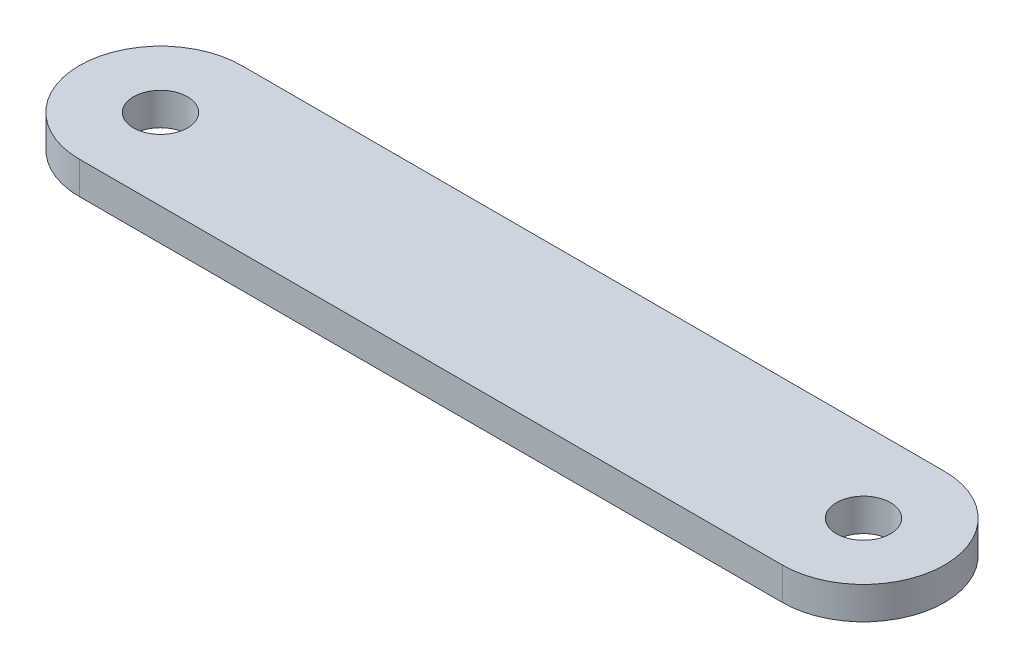
ISO-10303-21;
HEADER;
FILE_DESCRIPTION(('STEP AP214'),'2;1');
FILE_NAME('part.step','',(''),(''),'','','');
FILE_SCHEMA(('AUTOMOTIVE_DESIGN { 1 0 10303 214 1 1 1 1 }'));
ENDSEC;
DATA;
#1=APPLICATION_CONTEXT('core data for automotive mechanical design processes');
#2=APPLICATION_PROTOCOL_DEFINITION('international standard','automotive_design',2000,#1);
#3=PRODUCT_CONTEXT('',#1,'mechanical');
#4=PRODUCT('Part','Part','',(#3));
#5=PRODUCT_RELATED_PRODUCT_CATEGORY('part','',(#4));
#6=PRODUCT_DEFINITION_FORMATION('','',#4);
#7=PRODUCT_DEFINITION_CONTEXT('part definition',#1,'design');
#8=PRODUCT_DEFINITION('design','',#6,#7);
#9=PRODUCT_DEFINITION_SHAPE('','',#8);
#10=(LENGTH_UNIT() NAMED_UNIT(*) SI_UNIT(.MILLI.,.METRE.));
#11=(NAMED_UNIT(*) PLANE_ANGLE_UNIT() SI_UNIT($,.RADIAN.));
#12=(NAMED_UNIT(*) SI_UNIT($,.STERADIAN.) SOLID_ANGLE_UNIT());
#13=UNCERTAINTY_MEASURE_WITH_UNIT(LENGTH_MEASURE(1.E-05),#10,'distance_accuracy_value','');
#14=(GEOMETRIC_REPRESENTATION_CONTEXT(3) GLOBAL_UNCERTAINTY_ASSIGNED_CONTEXT((#13)) GLOBAL_UNIT_ASSIGNED_CONTEXT((#10,
#11,#12)) REPRESENTATION_CONTEXT('',''));
#15=CARTESIAN_POINT('',(0.,0.,0.));
#16=DIRECTION('',(0.,0.,1.));
#17=DIRECTION('',(1.,0.,0.));
#18=AXIS2_PLACEMENT_3D('',#15,#16,#17);
#19=CARTESIAN_POINT('',(123.5,6.,-13.5000000000001));
#20=DIRECTION('',(0.,1.,0.));
#21=DIRECTION('',(0.,0.,1.));
#22=AXIS2_PLACEMENT_3D('',#19,#20,#21);
#23=PLANE('',#22);
#24=CARTESIAN_POINT('',(-6.50000000000001,6.,-13.5));
#25=DIRECTION('',(0.,1.,0.));
#26=DIRECTION('',(0.,0.,1.));
#27=AXIS2_PLACEMENT_3D('',#24,#25,#26);
#28=CIRCLE('',#27,5.);
#29=CARTESIAN_POINT('',(-6.50000000000001,6.,-8.5));
#30=VERTEX_POINT('',#29);
#31=EDGE_CURVE('E104',#30,#30,#28,.T.);
#32=ORIENTED_EDGE('',*,*,#31,.F.);
#33=EDGE_LOOP('',(#32));
#34=FACE_BOUND('',#33,.T.);
#35=CARTESIAN_POINT('',(123.5,6.,-13.5000000000001));
#36=DIRECTION('',(0.,1.,0.));
#37=DIRECTION('',(0.,0.,1.));
#38=AXIS2_PLACEMENT_3D('',#35,#36,#37);
#39=CIRCLE('',#38,15.);
#40=CARTESIAN_POINT('',(123.5,6.,1.49999999999992));
#41=VERTEX_POINT('',#40);
#42=CARTESIAN_POINT('',(123.5,6.,-28.5000000000001));
#43=VERTEX_POINT('',#42);
#44=EDGE_CURVE('E89',#41,#43,#39,.T.);
#45=ORIENTED_EDGE('',*,*,#44,.T.);
#46=DIRECTION('',(-1.,0.,0.));
#47=VECTOR('',#46,1.);
#48=CARTESIAN_POINT('',(-6.50000000000001,6.,-28.5));
#49=LINE('',#48,#47);
#50=CARTESIAN_POINT('',(-6.50000000000001,6.,-28.5));
#51=VERTEX_POINT('',#50);
#52=EDGE_CURVE('E84',#43,#51,#49,.T.);
#53=ORIENTED_EDGE('',*,*,#52,.T.);
#54=CARTESIAN_POINT('',(-6.50000000000001,6.,-13.5));
#55=DIRECTION('',(0.,1.,0.));
#56=DIRECTION('',(0.,0.,1.));
#57=AXIS2_PLACEMENT_3D('',#54,#55,#56);
#58=CIRCLE('',#57,15.);
#59=CARTESIAN_POINT('',(-6.5,6.,1.5));
#60=VERTEX_POINT('',#59);
#61=EDGE_CURVE('E87',#51,#60,#58,.T.);
#62=ORIENTED_EDGE('',*,*,#61,.T.);
#63=DIRECTION('',(1.,0.,0.));
#64=VECTOR('',#63,1.);
#65=CARTESIAN_POINT('',(-6.5,6.,1.5));
#66=LINE('',#65,#64);
#67=EDGE_CURVE('E54',#60,#41,#66,.T.);
#68=ORIENTED_EDGE('',*,*,#67,.T.);
#69=EDGE_LOOP('',(#45,#53,#62,#68));
#70=FACE_BOUND('',#69,.T.);
#71=CARTESIAN_POINT('',(123.5,6.,-13.5000000000001));
#72=DIRECTION('',(0.,1.,0.));
#73=DIRECTION('',(0.,0.,1.));
#74=AXIS2_PLACEMENT_3D('',#71,#72,#73);
#75=CIRCLE('',#74,5.);
#76=CARTESIAN_POINT('',(123.5,6.,-8.50000000000008));
#77=VERTEX_POINT('',#76);
#78=EDGE_CURVE('E119',#77,#77,#75,.T.);
#79=ORIENTED_EDGE('',*,*,#78,.F.);
#80=EDGE_LOOP('',(#79));
#81=FACE_BOUND('',#80,.T.);
#82=ADVANCED_FACE('F37',(#34,#70,#81),#23,.T.);
#83=CARTESIAN_POINT('',(123.5,0.,-13.5000000000001));
#84=DIRECTION('',(0.,1.,0.));
#85=DIRECTION('',(0.,0.,1.));
#86=AXIS2_PLACEMENT_3D('',#83,#84,#85);
#87=PLANE('',#86);
#88=CARTESIAN_POINT('',(123.5,0.,-13.5000000000001));
#89=DIRECTION('',(0.,1.,0.));
#90=DIRECTION('',(0.,0.,1.));
#91=AXIS2_PLACEMENT_3D('',#88,#89,#90);
#92=CIRCLE('',#91,15.);
#93=CARTESIAN_POINT('',(123.5,0.,1.49999999999992));
#94=VERTEX_POINT('',#93);
#95=CARTESIAN_POINT('',(123.5,0.,-28.5000000000001));
#96=VERTEX_POINT('',#95);
#97=EDGE_CURVE('E101',#94,#96,#92,.T.);
#98=ORIENTED_EDGE('',*,*,#97,.F.);
#99=DIRECTION('',(1.,0.,0.));
#100=VECTOR('',#99,1.);
#101=CARTESIAN_POINT('',(-6.5,0.,1.5));
#102=LINE('',#101,#100);
#103=CARTESIAN_POINT('',(-6.5,0.,1.5));
#104=VERTEX_POINT('',#103);
#105=EDGE_CURVE('E77',#104,#94,#102,.T.);
#106=ORIENTED_EDGE('',*,*,#105,.F.);
#107=CARTESIAN_POINT('',(-6.50000000000001,0.,-13.5));
#108=DIRECTION('',(0.,1.,0.));
#109=DIRECTION('',(0.,0.,1.));
#110=AXIS2_PLACEMENT_3D('',#107,#108,#109);
#111=CIRCLE('',#110,15.);
#112=CARTESIAN_POINT('',(-6.50000000000001,0.,-28.5));
#113=VERTEX_POINT('',#112);
#114=EDGE_CURVE('E71',#113,#104,#111,.T.);
#115=ORIENTED_EDGE('',*,*,#114,.F.);
#116=DIRECTION('',(-1.,0.,0.));
#117=VECTOR('',#116,1.);
#118=CARTESIAN_POINT('',(-6.50000000000001,0.,-28.5));
#119=LINE('',#118,#117);
#120=EDGE_CURVE('E93',#96,#113,#119,.T.);
#121=ORIENTED_EDGE('',*,*,#120,.F.);
#122=EDGE_LOOP('',(#98,#106,#115,#121));
#123=FACE_BOUND('',#122,.T.);
#124=CARTESIAN_POINT('',(-6.50000000000001,0.,-13.5));
#125=DIRECTION('',(0.,1.,0.));
#126=DIRECTION('',(0.,0.,1.));
#127=AXIS2_PLACEMENT_3D('',#124,#125,#126);
#128=CIRCLE('',#127,5.);
#129=CARTESIAN_POINT('',(-6.50000000000001,0.,-8.5));
#130=VERTEX_POINT('',#129);
#131=EDGE_CURVE('E116',#130,#130,#128,.T.);
#132=ORIENTED_EDGE('',*,*,#131,.T.);
#133=EDGE_LOOP('',(#132));
#134=FACE_BOUND('',#133,.T.);
#135=CARTESIAN_POINT('',(123.5,0.,-13.5000000000001));
#136=DIRECTION('',(0.,1.,0.));
#137=DIRECTION('',(0.,0.,1.));
#138=AXIS2_PLACEMENT_3D('',#135,#136,#137);
#139=CIRCLE('',#138,5.);
#140=CARTESIAN_POINT('',(123.5,0.,-8.50000000000008));
#141=VERTEX_POINT('',#140);
#142=EDGE_CURVE('E122',#141,#141,#139,.T.);
#143=ORIENTED_EDGE('',*,*,#142,.T.);
#144=EDGE_LOOP('',(#143));
#145=FACE_BOUND('',#144,.T.);
#146=ADVANCED_FACE('F112',(#123,#134,#145),#87,.F.);
#147=CARTESIAN_POINT('',(123.5,6.,-13.5000000000001));
#148=DIRECTION('',(0.,-1.,0.));
#149=DIRECTION('',(0.,0.,-1.));
#150=AXIS2_PLACEMENT_3D('',#147,#148,#149);
#151=CYLINDRICAL_SURFACE('',#150,15.);
#152=ORIENTED_EDGE('',*,*,#97,.T.);
#153=DIRECTION('',(0.,-1.,0.));
#154=VECTOR('',#153,1.);
#155=CARTESIAN_POINT('',(123.5,6.,-28.5000000000001));
#156=LINE('',#155,#154);
#157=EDGE_CURVE('E11',#43,#96,#156,.T.);
#158=ORIENTED_EDGE('',*,*,#157,.F.);
#159=ORIENTED_EDGE('',*,*,#44,.F.);
#160=DIRECTION('',(0.,-1.,0.));
#161=VECTOR('',#160,1.);
#162=CARTESIAN_POINT('',(123.5,6.,1.49999999999992));
#163=LINE('',#162,#161);
#164=EDGE_CURVE('E97',#41,#94,#163,.T.);
#165=ORIENTED_EDGE('',*,*,#164,.T.);
#166=EDGE_LOOP('',(#152,#158,#159,#165));
#167=FACE_BOUND('',#166,.T.);
#168=ADVANCED_FACE('F39',(#167),#151,.T.);
#169=CARTESIAN_POINT('',(-6.50000000000001,6.,-28.5));
#170=DIRECTION('',(0.,0.,1.));
#171=DIRECTION('',(1.,0.,0.));
#172=AXIS2_PLACEMENT_3D('',#169,#170,#171);
#173=PLANE('',#172);
#174=ORIENTED_EDGE('',*,*,#120,.T.);
#175=DIRECTION('',(0.,-1.,0.));
#176=VECTOR('',#175,1.);
#177=CARTESIAN_POINT('',(-6.50000000000001,6.,-28.5));
#178=LINE('',#177,#176);
#179=EDGE_CURVE('E46',#51,#113,#178,.T.);
#180=ORIENTED_EDGE('',*,*,#179,.F.);
#181=ORIENTED_EDGE('',*,*,#52,.F.);
#182=ORIENTED_EDGE('',*,*,#157,.T.);
#183=EDGE_LOOP('',(#174,#180,#181,#182));
#184=FACE_BOUND('',#183,.T.);
#185=ADVANCED_FACE('F92',(#184),#173,.F.);
#186=CARTESIAN_POINT('',(-6.50000000000001,6.,-13.5));
#187=DIRECTION('',(0.,-1.,0.));
#188=DIRECTION('',(0.,0.,-1.));
#189=AXIS2_PLACEMENT_3D('',#186,#187,#188);
#190=CYLINDRICAL_SURFACE('',#189,15.);
#191=ORIENTED_EDGE('',*,*,#114,.T.);
#192=DIRECTION('',(0.,-1.,0.));
#193=VECTOR('',#192,1.);
#194=CARTESIAN_POINT('',(-6.5,6.,1.5));
#195=LINE('',#194,#193);
#196=EDGE_CURVE('E94',#60,#104,#195,.T.);
#197=ORIENTED_EDGE('',*,*,#196,.F.);
#198=ORIENTED_EDGE('',*,*,#61,.F.);
#199=ORIENTED_EDGE('',*,*,#179,.T.);
#200=EDGE_LOOP('',(#191,#197,#198,#199));
#201=FACE_BOUND('',#200,.T.);
#202=ADVANCED_FACE('F95',(#201),#190,.T.);
#203=CARTESIAN_POINT('',(-6.5,6.,1.5));
#204=DIRECTION('',(0.,0.,-1.));
#205=DIRECTION('',(-1.,0.,0.));
#206=AXIS2_PLACEMENT_3D('',#203,#204,#205);
#207=PLANE('',#206);
#208=ORIENTED_EDGE('',*,*,#105,.T.);
#209=ORIENTED_EDGE('',*,*,#164,.F.);
#210=ORIENTED_EDGE('',*,*,#67,.F.);
#211=ORIENTED_EDGE('',*,*,#196,.T.);
#212=EDGE_LOOP('',(#208,#209,#210,#211));
#213=FACE_BOUND('',#212,.T.);
#214=ADVANCED_FACE('F109',(#213),#207,.F.);
#215=CARTESIAN_POINT('',(-6.50000000000001,6.,-13.5));
#216=DIRECTION('',(0.,-1.,0.));
#217=DIRECTION('',(0.,0.,-1.));
#218=AXIS2_PLACEMENT_3D('',#215,#216,#217);
#219=CYLINDRICAL_SURFACE('',#218,5.);
#220=ORIENTED_EDGE('',*,*,#31,.T.);
#221=EDGE_LOOP('',(#220));
#222=FACE_BOUND('',#221,.T.);
#223=ORIENTED_EDGE('',*,*,#131,.F.);
#224=EDGE_LOOP('',(#223));
#225=FACE_BOUND('',#224,.T.);
#226=ADVANCED_FACE('F139',(#222,#225),#219,.F.);
#227=CARTESIAN_POINT('',(123.5,6.,-13.5000000000001));
#228=DIRECTION('',(0.,-1.,0.));
#229=DIRECTION('',(0.,0.,-1.));
#230=AXIS2_PLACEMENT_3D('',#227,#228,#229);
#231=CYLINDRICAL_SURFACE('',#230,5.);
#232=ORIENTED_EDGE('',*,*,#78,.T.);
#233=EDGE_LOOP('',(#232));
#234=FACE_BOUND('',#233,.T.);
#235=ORIENTED_EDGE('',*,*,#142,.F.);
#236=EDGE_LOOP('',(#235));
#237=FACE_BOUND('',#236,.T.);
#238=ADVANCED_FACE('F128',(#234,#237),#231,.F.);
#239=CLOSED_SHELL('',(#82,#146,#168,#185,#202,#214,#226,#238));
#240=MANIFOLD_SOLID_BREP('B2',#239);
#241=ADVANCED_BREP_SHAPE_REPRESENTATION('',(#18,#240),#14);
#242=SHAPE_DEFINITION_REPRESENTATION(#9,#241);
ENDSEC;
END-ISO-10303-21;
